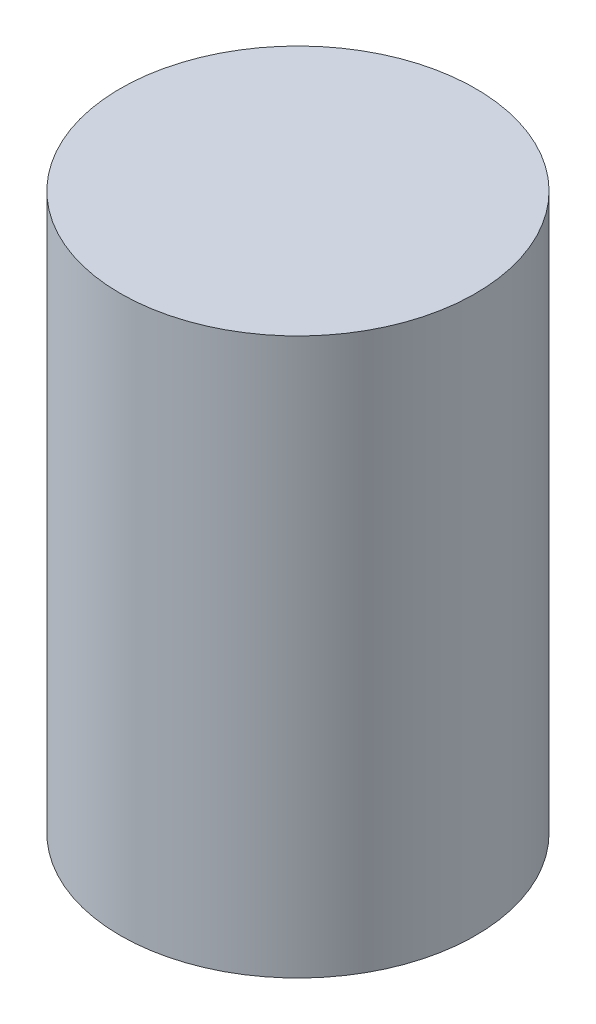
ISO-10303-21;
HEADER;
FILE_DESCRIPTION(('STEP AP214'),'2;1');
FILE_NAME('part.step','',(''),(''),'','','');
FILE_SCHEMA(('AUTOMOTIVE_DESIGN { 1 0 10303 214 1 1 1 1 }'));
ENDSEC;
DATA;
#1=APPLICATION_CONTEXT('core data for automotive mechanical design processes');
#2=APPLICATION_PROTOCOL_DEFINITION('international standard','automotive_design',2000,#1);
#3=PRODUCT_CONTEXT('',#1,'mechanical');
#4=PRODUCT('Part','Part','',(#3));
#5=PRODUCT_RELATED_PRODUCT_CATEGORY('part','',(#4));
#6=PRODUCT_DEFINITION_FORMATION('','',#4);
#7=PRODUCT_DEFINITION_CONTEXT('part definition',#1,'design');
#8=PRODUCT_DEFINITION('design','',#6,#7);
#9=PRODUCT_DEFINITION_SHAPE('','',#8);
#10=(LENGTH_UNIT() NAMED_UNIT(*) SI_UNIT(.MILLI.,.METRE.));
#11=(NAMED_UNIT(*) PLANE_ANGLE_UNIT() SI_UNIT($,.RADIAN.));
#12=(NAMED_UNIT(*) SI_UNIT($,.STERADIAN.) SOLID_ANGLE_UNIT());
#13=UNCERTAINTY_MEASURE_WITH_UNIT(LENGTH_MEASURE(1.E-05),#10,'distance_accuracy_value','');
#14=(GEOMETRIC_REPRESENTATION_CONTEXT(3) GLOBAL_UNCERTAINTY_ASSIGNED_CONTEXT((#13)) GLOBAL_UNIT_ASSIGNED_CONTEXT((#10,
#11,#12)) REPRESENTATION_CONTEXT('',''));
#15=CARTESIAN_POINT('',(0.,0.,0.));
#16=DIRECTION('',(0.,0.,1.));
#17=DIRECTION('',(1.,0.,0.));
#18=AXIS2_PLACEMENT_3D('',#15,#16,#17);
#19=CARTESIAN_POINT('',(0.,31.,0.));
#20=DIRECTION('',(0.,-1.,0.));
#21=DIRECTION('',(0.,0.,-1.));
#22=AXIS2_PLACEMENT_3D('',#19,#20,#21);
#23=CYLINDRICAL_SURFACE('',#22,9.9);
#24=CARTESIAN_POINT('',(0.,31.,0.));
#25=DIRECTION('',(0.,1.,0.));
#26=DIRECTION('',(0.,0.,1.));
#27=AXIS2_PLACEMENT_3D('',#24,#25,#26);
#28=CIRCLE('',#27,9.9);
#29=CARTESIAN_POINT('',(0.,31.,9.9));
#30=VERTEX_POINT('',#29);
#31=EDGE_CURVE('E10',#30,#30,#28,.T.);
#32=ORIENTED_EDGE('',*,*,#31,.F.);
#33=EDGE_LOOP('',(#32));
#34=FACE_BOUND('',#33,.T.);
#35=CARTESIAN_POINT('',(0.,0.,0.));
#36=DIRECTION('',(0.,1.,0.));
#37=DIRECTION('',(0.,0.,1.));
#38=AXIS2_PLACEMENT_3D('',#35,#36,#37);
#39=CIRCLE('',#38,9.9);
#40=CARTESIAN_POINT('',(0.,0.,9.9));
#41=VERTEX_POINT('',#40);
#42=EDGE_CURVE('E34',#41,#41,#39,.T.);
#43=ORIENTED_EDGE('',*,*,#42,.T.);
#44=EDGE_LOOP('',(#43));
#45=FACE_BOUND('',#44,.T.);
#46=ADVANCED_FACE('F31',(#34,#45),#23,.T.);
#47=CARTESIAN_POINT('',(0.,31.,0.));
#48=DIRECTION('',(0.,1.,0.));
#49=DIRECTION('',(0.,0.,1.));
#50=AXIS2_PLACEMENT_3D('',#47,#48,#49);
#51=PLANE('',#50);
#52=ORIENTED_EDGE('',*,*,#31,.T.);
#53=EDGE_LOOP('',(#52));
#54=FACE_BOUND('',#53,.T.);
#55=ADVANCED_FACE('F46',(#54),#51,.T.);
#56=CARTESIAN_POINT('',(0.,0.,0.));
#57=DIRECTION('',(0.,1.,0.));
#58=DIRECTION('',(0.,0.,1.));
#59=AXIS2_PLACEMENT_3D('',#56,#57,#58);
#60=PLANE('',#59);
#61=ORIENTED_EDGE('',*,*,#42,.F.);
#62=EDGE_LOOP('',(#61));
#63=FACE_BOUND('',#62,.T.);
#64=ADVANCED_FACE('F44',(#63),#60,.F.);
#65=CLOSED_SHELL('',(#46,#55,#64));
#66=MANIFOLD_SOLID_BREP('B2',#65);
#67=ADVANCED_BREP_SHAPE_REPRESENTATION('',(#18,#66),#14);
#68=SHAPE_DEFINITION_REPRESENTATION(#9,#67);
ENDSEC;
END-ISO-10303-21;
